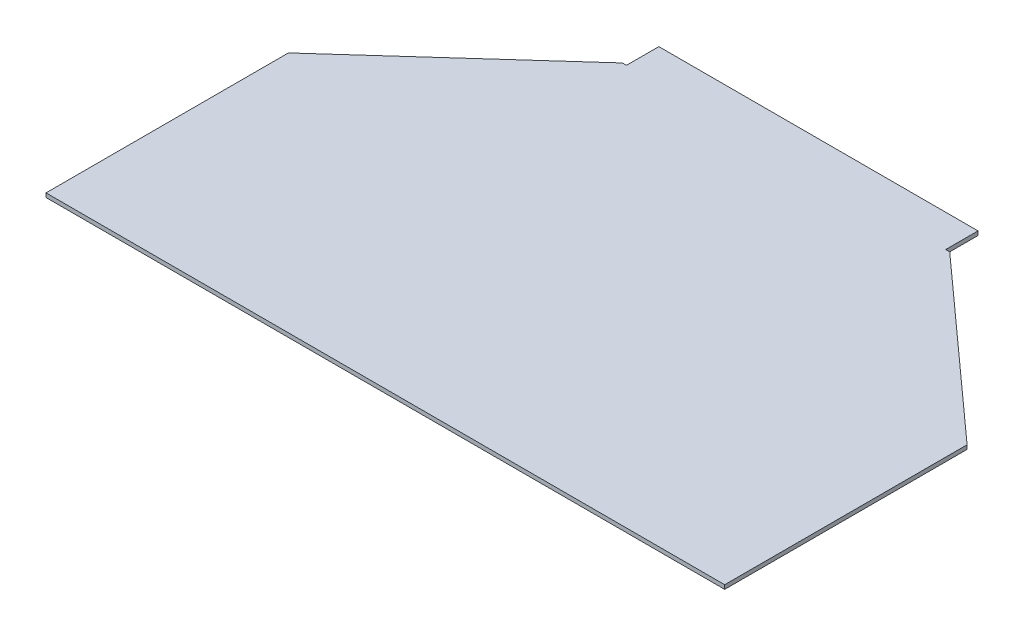
ISO-10303-21;
HEADER;
FILE_DESCRIPTION(('STEP AP214'),'2;1');
FILE_NAME('part.step','',(''),(''),'','','');
FILE_SCHEMA(('AUTOMOTIVE_DESIGN { 1 0 10303 214 1 1 1 1 }'));
ENDSEC;
DATA;
#1=APPLICATION_CONTEXT('core data for automotive mechanical design processes');
#2=APPLICATION_PROTOCOL_DEFINITION('international standard','automotive_design',2000,#1);
#3=PRODUCT_CONTEXT('',#1,'mechanical');
#4=PRODUCT('Part','Part','',(#3));
#5=PRODUCT_RELATED_PRODUCT_CATEGORY('part','',(#4));
#6=PRODUCT_DEFINITION_FORMATION('','',#4);
#7=PRODUCT_DEFINITION_CONTEXT('part definition',#1,'design');
#8=PRODUCT_DEFINITION('design','',#6,#7);
#9=PRODUCT_DEFINITION_SHAPE('','',#8);
#10=(LENGTH_UNIT() NAMED_UNIT(*) SI_UNIT(.MILLI.,.METRE.));
#11=(NAMED_UNIT(*) PLANE_ANGLE_UNIT() SI_UNIT($,.RADIAN.));
#12=(NAMED_UNIT(*) SI_UNIT($,.STERADIAN.) SOLID_ANGLE_UNIT());
#13=UNCERTAINTY_MEASURE_WITH_UNIT(LENGTH_MEASURE(1.E-05),#10,'distance_accuracy_value','');
#14=(GEOMETRIC_REPRESENTATION_CONTEXT(3) GLOBAL_UNCERTAINTY_ASSIGNED_CONTEXT((#13)) GLOBAL_UNIT_ASSIGNED_CONTEXT((#10,
#11,#12)) REPRESENTATION_CONTEXT('',''));
#15=CARTESIAN_POINT('',(0.,0.,0.));
#16=DIRECTION('',(0.,0.,1.));
#17=DIRECTION('',(1.,0.,0.));
#18=AXIS2_PLACEMENT_3D('',#15,#16,#17);
#19=CARTESIAN_POINT('',(266.7,-3.175,340.36));
#20=DIRECTION('',(1.,0.,0.));
#21=DIRECTION('',(0.,0.,-1.));
#22=AXIS2_PLACEMENT_3D('',#19,#20,#21);
#23=PLANE('',#22);
#24=DIRECTION('',(0.,0.,-1.));
#25=VECTOR('',#24,1.);
#26=CARTESIAN_POINT('',(266.7,0.,340.36));
#27=LINE('',#26,#25);
#28=CARTESIAN_POINT('',(266.7,0.,340.36));
#29=VERTEX_POINT('',#28);
#30=CARTESIAN_POINT('',(266.7,0.,149.86));
#31=VERTEX_POINT('',#30);
#32=EDGE_CURVE('E146',#29,#31,#27,.T.);
#33=ORIENTED_EDGE('',*,*,#32,.F.);
#34=DIRECTION('',(0.,1.,0.));
#35=VECTOR('',#34,1.);
#36=CARTESIAN_POINT('',(266.7,-3.175,340.36));
#37=LINE('',#36,#35);
#38=CARTESIAN_POINT('',(266.7,-3.175,340.36));
#39=VERTEX_POINT('',#38);
#40=EDGE_CURVE('E11',#39,#29,#37,.T.);
#41=ORIENTED_EDGE('',*,*,#40,.F.);
#42=DIRECTION('',(0.,0.,-1.));
#43=VECTOR('',#42,1.);
#44=CARTESIAN_POINT('',(266.7,-3.175,340.36));
#45=LINE('',#44,#43);
#46=CARTESIAN_POINT('',(266.7,-3.175,149.86));
#47=VERTEX_POINT('',#46);
#48=EDGE_CURVE('E172',#39,#47,#45,.T.);
#49=ORIENTED_EDGE('',*,*,#48,.T.);
#50=DIRECTION('',(0.,1.,0.));
#51=VECTOR('',#50,1.);
#52=CARTESIAN_POINT('',(266.7,-3.175,149.86));
#53=LINE('',#52,#51);
#54=EDGE_CURVE('E40',#47,#31,#53,.T.);
#55=ORIENTED_EDGE('',*,*,#54,.T.);
#56=EDGE_LOOP('',(#33,#41,#49,#55));
#57=FACE_BOUND('',#56,.T.);
#58=ADVANCED_FACE('F37',(#57),#23,.T.);
#59=CARTESIAN_POINT('',(-266.7,-3.175,340.36));
#60=DIRECTION('',(0.,0.,1.));
#61=DIRECTION('',(1.,0.,0.));
#62=AXIS2_PLACEMENT_3D('',#59,#60,#61);
#63=PLANE('',#62);
#64=DIRECTION('',(1.,0.,0.));
#65=VECTOR('',#64,1.);
#66=CARTESIAN_POINT('',(-266.7,0.,340.36));
#67=LINE('',#66,#65);
#68=CARTESIAN_POINT('',(-266.7,0.,340.36));
#69=VERTEX_POINT('',#68);
#70=EDGE_CURVE('E170',#69,#29,#67,.T.);
#71=ORIENTED_EDGE('',*,*,#70,.F.);
#72=DIRECTION('',(0.,1.,0.));
#73=VECTOR('',#72,1.);
#74=CARTESIAN_POINT('',(-266.7,-3.175,340.36));
#75=LINE('',#74,#73);
#76=CARTESIAN_POINT('',(-266.7,-3.175,340.36));
#77=VERTEX_POINT('',#76);
#78=EDGE_CURVE('E46',#77,#69,#75,.T.);
#79=ORIENTED_EDGE('',*,*,#78,.F.);
#80=DIRECTION('',(1.,0.,0.));
#81=VECTOR('',#80,1.);
#82=CARTESIAN_POINT('',(-266.7,-3.175,340.36));
#83=LINE('',#82,#81);
#84=EDGE_CURVE('E136',#77,#39,#83,.T.);
#85=ORIENTED_EDGE('',*,*,#84,.T.);
#86=ORIENTED_EDGE('',*,*,#40,.T.);
#87=EDGE_LOOP('',(#71,#79,#85,#86));
#88=FACE_BOUND('',#87,.T.);
#89=ADVANCED_FACE('F188',(#88),#63,.T.);
#90=CARTESIAN_POINT('',(-266.7,-3.175,149.86));
#91=DIRECTION('',(-1.,0.,0.));
#92=DIRECTION('',(0.,0.,1.));
#93=AXIS2_PLACEMENT_3D('',#90,#91,#92);
#94=PLANE('',#93);
#95=DIRECTION('',(0.,0.,1.));
#96=VECTOR('',#95,1.);
#97=CARTESIAN_POINT('',(-266.7,0.,149.86));
#98=LINE('',#97,#96);
#99=CARTESIAN_POINT('',(-266.7,0.,149.86));
#100=VERTEX_POINT('',#99);
#101=EDGE_CURVE('E123',#100,#69,#98,.T.);
#102=ORIENTED_EDGE('',*,*,#101,.F.);
#103=DIRECTION('',(0.,1.,0.));
#104=VECTOR('',#103,1.);
#105=CARTESIAN_POINT('',(-266.7,-3.175,149.86));
#106=LINE('',#105,#104);
#107=CARTESIAN_POINT('',(-266.7,-3.175,149.86));
#108=VERTEX_POINT('',#107);
#109=EDGE_CURVE('E118',#108,#100,#106,.T.);
#110=ORIENTED_EDGE('',*,*,#109,.F.);
#111=DIRECTION('',(0.,0.,1.));
#112=VECTOR('',#111,1.);
#113=CARTESIAN_POINT('',(-266.7,-3.175,149.86));
#114=LINE('',#113,#112);
#115=EDGE_CURVE('E121',#108,#77,#114,.T.);
#116=ORIENTED_EDGE('',*,*,#115,.T.);
#117=ORIENTED_EDGE('',*,*,#78,.T.);
#118=EDGE_LOOP('',(#102,#110,#116,#117));
#119=FACE_BOUND('',#118,.T.);
#120=ADVANCED_FACE('F120',(#119),#94,.T.);
#121=CARTESIAN_POINT('',(-128.5875,-3.175,25.4));
#122=DIRECTION('',(-0.66943634986802,0.,-0.742869418858645));
#123=DIRECTION('',(-0.742869418858645,0.,0.669436349868021));
#124=AXIS2_PLACEMENT_3D('',#121,#122,#123);
#125=PLANE('',#124);
#126=DIRECTION('',(-0.742869418858645,0.,0.669436349868021));
#127=VECTOR('',#126,1.);
#128=CARTESIAN_POINT('',(-128.5875,0.,25.4));
#129=LINE('',#128,#127);
#130=CARTESIAN_POINT('',(-128.5875,0.,25.4));
#131=VERTEX_POINT('',#130);
#132=EDGE_CURVE('E167',#131,#100,#129,.T.);
#133=ORIENTED_EDGE('',*,*,#132,.F.);
#134=DIRECTION('',(0.,1.,0.));
#135=VECTOR('',#134,1.);
#136=CARTESIAN_POINT('',(-128.5875,-3.175,25.4));
#137=LINE('',#136,#135);
#138=CARTESIAN_POINT('',(-128.5875,-3.175,25.4));
#139=VERTEX_POINT('',#138);
#140=EDGE_CURVE('E128',#139,#131,#137,.T.);
#141=ORIENTED_EDGE('',*,*,#140,.F.);
#142=DIRECTION('',(-0.742869418858645,0.,0.669436349868021));
#143=VECTOR('',#142,1.);
#144=CARTESIAN_POINT('',(-128.5875,-3.175,25.4));
#145=LINE('',#144,#143);
#146=EDGE_CURVE('E134',#139,#108,#145,.T.);
#147=ORIENTED_EDGE('',*,*,#146,.T.);
#148=ORIENTED_EDGE('',*,*,#109,.T.);
#149=EDGE_LOOP('',(#133,#141,#147,#148));
#150=FACE_BOUND('',#149,.T.);
#151=ADVANCED_FACE('F138',(#150),#125,.T.);
#152=CARTESIAN_POINT('',(-125.4125,-3.175,25.4));
#153=DIRECTION('',(0.,0.,-1.));
#154=DIRECTION('',(-1.,0.,0.));
#155=AXIS2_PLACEMENT_3D('',#152,#153,#154);
#156=PLANE('',#155);
#157=DIRECTION('',(-1.,0.,0.));
#158=VECTOR('',#157,1.);
#159=CARTESIAN_POINT('',(-125.4125,0.,25.4));
#160=LINE('',#159,#158);
#161=CARTESIAN_POINT('',(-125.4125,0.,25.4));
#162=VERTEX_POINT('',#161);
#163=EDGE_CURVE('E164',#162,#131,#160,.T.);
#164=ORIENTED_EDGE('',*,*,#163,.F.);
#165=DIRECTION('',(0.,1.,0.));
#166=VECTOR('',#165,1.);
#167=CARTESIAN_POINT('',(-125.4125,-3.175,25.4));
#168=LINE('',#167,#166);
#169=CARTESIAN_POINT('',(-125.4125,-3.175,25.4));
#170=VERTEX_POINT('',#169);
#171=EDGE_CURVE('E176',#170,#162,#168,.T.);
#172=ORIENTED_EDGE('',*,*,#171,.F.);
#173=DIRECTION('',(-1.,0.,0.));
#174=VECTOR('',#173,1.);
#175=CARTESIAN_POINT('',(-125.4125,-3.175,25.4));
#176=LINE('',#175,#174);
#177=EDGE_CURVE('E139',#170,#139,#176,.T.);
#178=ORIENTED_EDGE('',*,*,#177,.T.);
#179=ORIENTED_EDGE('',*,*,#140,.T.);
#180=EDGE_LOOP('',(#164,#172,#178,#179));
#181=FACE_BOUND('',#180,.T.);
#182=ADVANCED_FACE('F201',(#181),#156,.T.);
#183=CARTESIAN_POINT('',(-125.4125,-3.175,0.));
#184=DIRECTION('',(-1.,0.,0.));
#185=DIRECTION('',(0.,0.,1.));
#186=AXIS2_PLACEMENT_3D('',#183,#184,#185);
#187=PLANE('',#186);
#188=DIRECTION('',(0.,0.,1.));
#189=VECTOR('',#188,1.);
#190=CARTESIAN_POINT('',(-125.4125,0.,0.));
#191=LINE('',#190,#189);
#192=CARTESIAN_POINT('',(-125.4125,0.,0.));
#193=VERTEX_POINT('',#192);
#194=EDGE_CURVE('E161',#193,#162,#191,.T.);
#195=ORIENTED_EDGE('',*,*,#194,.F.);
#196=DIRECTION('',(0.,1.,0.));
#197=VECTOR('',#196,1.);
#198=CARTESIAN_POINT('',(-125.4125,-3.175,0.));
#199=LINE('',#198,#197);
#200=CARTESIAN_POINT('',(-125.4125,-3.175,0.));
#201=VERTEX_POINT('',#200);
#202=EDGE_CURVE('E178',#201,#193,#199,.T.);
#203=ORIENTED_EDGE('',*,*,#202,.F.);
#204=DIRECTION('',(0.,0.,1.));
#205=VECTOR('',#204,1.);
#206=CARTESIAN_POINT('',(-125.4125,-3.175,0.));
#207=LINE('',#206,#205);
#208=EDGE_CURVE('E141',#201,#170,#207,.T.);
#209=ORIENTED_EDGE('',*,*,#208,.T.);
#210=ORIENTED_EDGE('',*,*,#171,.T.);
#211=EDGE_LOOP('',(#195,#203,#209,#210));
#212=FACE_BOUND('',#211,.T.);
#213=ADVANCED_FACE('F204',(#212),#187,.T.);
#214=CARTESIAN_POINT('',(125.4125,-3.175,0.));
#215=DIRECTION('',(0.,0.,-1.));
#216=DIRECTION('',(-1.,0.,0.));
#217=AXIS2_PLACEMENT_3D('',#214,#215,#216);
#218=PLANE('',#217);
#219=DIRECTION('',(-1.,0.,0.));
#220=VECTOR('',#219,1.);
#221=CARTESIAN_POINT('',(125.4125,0.,0.));
#222=LINE('',#221,#220);
#223=CARTESIAN_POINT('',(125.4125,0.,0.));
#224=VERTEX_POINT('',#223);
#225=EDGE_CURVE('E158',#224,#193,#222,.T.);
#226=ORIENTED_EDGE('',*,*,#225,.F.);
#227=DIRECTION('',(0.,1.,0.));
#228=VECTOR('',#227,1.);
#229=CARTESIAN_POINT('',(125.4125,-3.175,0.));
#230=LINE('',#229,#228);
#231=CARTESIAN_POINT('',(125.4125,-3.175,0.));
#232=VERTEX_POINT('',#231);
#233=EDGE_CURVE('E180',#232,#224,#230,.T.);
#234=ORIENTED_EDGE('',*,*,#233,.F.);
#235=DIRECTION('',(-1.,0.,0.));
#236=VECTOR('',#235,1.);
#237=CARTESIAN_POINT('',(125.4125,-3.175,0.));
#238=LINE('',#237,#236);
#239=EDGE_CURVE('E327',#232,#201,#238,.T.);
#240=ORIENTED_EDGE('',*,*,#239,.T.);
#241=ORIENTED_EDGE('',*,*,#202,.T.);
#242=EDGE_LOOP('',(#226,#234,#240,#241));
#243=FACE_BOUND('',#242,.T.);
#244=ADVANCED_FACE('F208',(#243),#218,.T.);
#245=CARTESIAN_POINT('',(125.4125,-3.175,25.3999999999999));
#246=DIRECTION('',(1.,0.,0.));
#247=DIRECTION('',(0.,0.,-1.));
#248=AXIS2_PLACEMENT_3D('',#245,#246,#247);
#249=PLANE('',#248);
#250=DIRECTION('',(0.,0.,-1.));
#251=VECTOR('',#250,1.);
#252=CARTESIAN_POINT('',(125.4125,0.,25.3999999999999));
#253=LINE('',#252,#251);
#254=CARTESIAN_POINT('',(125.4125,0.,25.3999999999999));
#255=VERTEX_POINT('',#254);
#256=EDGE_CURVE('E155',#255,#224,#253,.T.);
#257=ORIENTED_EDGE('',*,*,#256,.F.);
#258=DIRECTION('',(0.,1.,0.));
#259=VECTOR('',#258,1.);
#260=CARTESIAN_POINT('',(125.4125,-3.175,25.3999999999999));
#261=LINE('',#260,#259);
#262=CARTESIAN_POINT('',(125.4125,-3.175,25.3999999999999));
#263=VERTEX_POINT('',#262);
#264=EDGE_CURVE('E182',#263,#255,#261,.T.);
#265=ORIENTED_EDGE('',*,*,#264,.F.);
#266=DIRECTION('',(0.,0.,-1.));
#267=VECTOR('',#266,1.);
#268=CARTESIAN_POINT('',(125.4125,-3.175,25.3999999999999));
#269=LINE('',#268,#267);
#270=EDGE_CURVE('E323',#263,#232,#269,.T.);
#271=ORIENTED_EDGE('',*,*,#270,.T.);
#272=ORIENTED_EDGE('',*,*,#233,.T.);
#273=EDGE_LOOP('',(#257,#265,#271,#272));
#274=FACE_BOUND('',#273,.T.);
#275=ADVANCED_FACE('F212',(#274),#249,.T.);
#276=CARTESIAN_POINT('',(128.5875,-3.175,25.3999999999999));
#277=DIRECTION('',(0.,0.,-1.));
#278=DIRECTION('',(-1.,0.,0.));
#279=AXIS2_PLACEMENT_3D('',#276,#277,#278);
#280=PLANE('',#279);
#281=DIRECTION('',(-1.,0.,0.));
#282=VECTOR('',#281,1.);
#283=CARTESIAN_POINT('',(128.5875,0.,25.3999999999999));
#284=LINE('',#283,#282);
#285=CARTESIAN_POINT('',(128.5875,0.,25.3999999999999));
#286=VERTEX_POINT('',#285);
#287=EDGE_CURVE('E152',#286,#255,#284,.T.);
#288=ORIENTED_EDGE('',*,*,#287,.F.);
#289=DIRECTION('',(0.,1.,0.));
#290=VECTOR('',#289,1.);
#291=CARTESIAN_POINT('',(128.5875,-3.175,25.3999999999999));
#292=LINE('',#291,#290);
#293=CARTESIAN_POINT('',(128.5875,-3.175,25.3999999999999));
#294=VERTEX_POINT('',#293);
#295=EDGE_CURVE('E183',#294,#286,#292,.T.);
#296=ORIENTED_EDGE('',*,*,#295,.F.);
#297=DIRECTION('',(-1.,0.,0.));
#298=VECTOR('',#297,1.);
#299=CARTESIAN_POINT('',(128.5875,-3.175,25.3999999999999));
#300=LINE('',#299,#298);
#301=EDGE_CURVE('E334',#294,#263,#300,.T.);
#302=ORIENTED_EDGE('',*,*,#301,.T.);
#303=ORIENTED_EDGE('',*,*,#264,.T.);
#304=EDGE_LOOP('',(#288,#296,#302,#303));
#305=FACE_BOUND('',#304,.T.);
#306=ADVANCED_FACE('F216',(#305),#280,.T.);
#307=CARTESIAN_POINT('',(266.7,-3.175,149.86));
#308=DIRECTION('',(0.669436349868021,0.,-0.742869418858645));
#309=DIRECTION('',(-0.742869418858645,0.,-0.669436349868021));
#310=AXIS2_PLACEMENT_3D('',#307,#308,#309);
#311=PLANE('',#310);
#312=DIRECTION('',(-0.742869418858645,0.,-0.669436349868021));
#313=VECTOR('',#312,1.);
#314=CARTESIAN_POINT('',(266.7,0.,149.86));
#315=LINE('',#314,#313);
#316=EDGE_CURVE('E149',#31,#286,#315,.T.);
#317=ORIENTED_EDGE('',*,*,#316,.F.);
#318=ORIENTED_EDGE('',*,*,#54,.F.);
#319=DIRECTION('',(-0.742869418858645,0.,-0.669436349868021));
#320=VECTOR('',#319,1.);
#321=CARTESIAN_POINT('',(266.7,-3.175,149.86));
#322=LINE('',#321,#320);
#323=EDGE_CURVE('E336',#47,#294,#322,.T.);
#324=ORIENTED_EDGE('',*,*,#323,.T.);
#325=ORIENTED_EDGE('',*,*,#295,.T.);
#326=EDGE_LOOP('',(#317,#318,#324,#325));
#327=FACE_BOUND('',#326,.T.);
#328=ADVANCED_FACE('F185',(#327),#311,.T.);
#329=CARTESIAN_POINT('',(0.,-3.175,0.));
#330=DIRECTION('',(0.,1.,0.));
#331=DIRECTION('',(0.,0.,1.));
#332=AXIS2_PLACEMENT_3D('',#329,#330,#331);
#333=PLANE('',#332);
#334=ORIENTED_EDGE('',*,*,#48,.F.);
#335=ORIENTED_EDGE('',*,*,#84,.F.);
#336=ORIENTED_EDGE('',*,*,#115,.F.);
#337=ORIENTED_EDGE('',*,*,#146,.F.);
#338=ORIENTED_EDGE('',*,*,#177,.F.);
#339=ORIENTED_EDGE('',*,*,#208,.F.);
#340=ORIENTED_EDGE('',*,*,#239,.F.);
#341=ORIENTED_EDGE('',*,*,#270,.F.);
#342=ORIENTED_EDGE('',*,*,#301,.F.);
#343=ORIENTED_EDGE('',*,*,#323,.F.);
#344=EDGE_LOOP('',(#334,#335,#336,#337,#338,#339,#340,#341,#342,#343));
#345=FACE_BOUND('',#344,.T.);
#346=ADVANCED_FACE('F132',(#345),#333,.F.);
#347=CARTESIAN_POINT('',(0.,0.,0.));
#348=DIRECTION('',(0.,1.,0.));
#349=DIRECTION('',(0.,0.,1.));
#350=AXIS2_PLACEMENT_3D('',#347,#348,#349);
#351=PLANE('',#350);
#352=ORIENTED_EDGE('',*,*,#32,.T.);
#353=ORIENTED_EDGE('',*,*,#316,.T.);
#354=ORIENTED_EDGE('',*,*,#287,.T.);
#355=ORIENTED_EDGE('',*,*,#256,.T.);
#356=ORIENTED_EDGE('',*,*,#225,.T.);
#357=ORIENTED_EDGE('',*,*,#194,.T.);
#358=ORIENTED_EDGE('',*,*,#163,.T.);
#359=ORIENTED_EDGE('',*,*,#132,.T.);
#360=ORIENTED_EDGE('',*,*,#101,.T.);
#361=ORIENTED_EDGE('',*,*,#70,.T.);
#362=EDGE_LOOP('',(#352,#353,#354,#355,#356,#357,#358,#359,#360,#361));
#363=FACE_BOUND('',#362,.T.);
#364=ADVANCED_FACE('F187',(#363),#351,.T.);
#365=CLOSED_SHELL('',(#58,#89,#120,#151,#182,#213,#244,#275,#306,#328,#346,#364));
#366=MANIFOLD_SOLID_BREP('B2',#365);
#367=ADVANCED_BREP_SHAPE_REPRESENTATION('',(#18,#366),#14);
#368=SHAPE_DEFINITION_REPRESENTATION(#9,#367);
ENDSEC;
END-ISO-10303-21;
